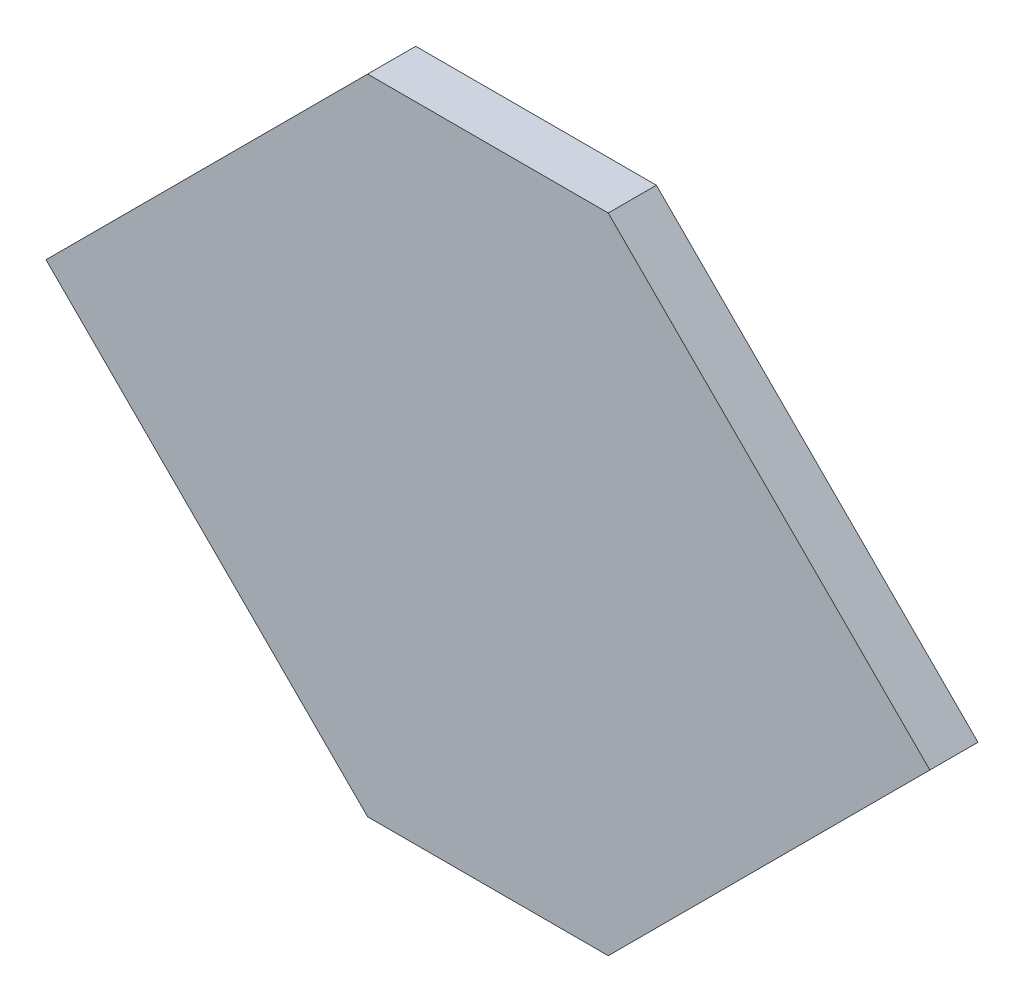
ISO-10303-21;
HEADER;
FILE_DESCRIPTION(('STEP AP214'),'2;1');
FILE_NAME('part.step','',(''),(''),'','','');
FILE_SCHEMA(('AUTOMOTIVE_DESIGN { 1 0 10303 214 1 1 1 1 }'));
ENDSEC;
DATA;
#1=APPLICATION_CONTEXT('core data for automotive mechanical design processes');
#2=APPLICATION_PROTOCOL_DEFINITION('international standard','automotive_design',2000,#1);
#3=PRODUCT_CONTEXT('',#1,'mechanical');
#4=PRODUCT('Part','Part','',(#3));
#5=PRODUCT_RELATED_PRODUCT_CATEGORY('part','',(#4));
#6=PRODUCT_DEFINITION_FORMATION('','',#4);
#7=PRODUCT_DEFINITION_CONTEXT('part definition',#1,'design');
#8=PRODUCT_DEFINITION('design','',#6,#7);
#9=PRODUCT_DEFINITION_SHAPE('','',#8);
#10=(LENGTH_UNIT() NAMED_UNIT(*) SI_UNIT(.MILLI.,.METRE.));
#11=(NAMED_UNIT(*) PLANE_ANGLE_UNIT() SI_UNIT($,.RADIAN.));
#12=(NAMED_UNIT(*) SI_UNIT($,.STERADIAN.) SOLID_ANGLE_UNIT());
#13=UNCERTAINTY_MEASURE_WITH_UNIT(LENGTH_MEASURE(1.E-05),#10,'distance_accuracy_value','');
#14=(GEOMETRIC_REPRESENTATION_CONTEXT(3) GLOBAL_UNCERTAINTY_ASSIGNED_CONTEXT((#13)) GLOBAL_UNIT_ASSIGNED_CONTEXT((#10,
#11,#12)) REPRESENTATION_CONTEXT('',''));
#15=CARTESIAN_POINT('',(0.,0.,0.));
#16=DIRECTION('',(0.,0.,1.));
#17=DIRECTION('',(1.,0.,0.));
#18=AXIS2_PLACEMENT_3D('',#15,#16,#17);
#19=CARTESIAN_POINT('',(-25.,-66.82,10.));
#20=DIRECTION('',(0.,1.,0.));
#21=DIRECTION('',(0.,0.,1.));
#22=AXIS2_PLACEMENT_3D('',#19,#20,#21);
#23=PLANE('',#22);
#24=DIRECTION('',(1.,0.,0.));
#25=VECTOR('',#24,1.);
#26=CARTESIAN_POINT('',(-25.,-66.82,0.));
#27=LINE('',#26,#25);
#28=CARTESIAN_POINT('',(-25.,-66.82,0.));
#29=VERTEX_POINT('',#28);
#30=CARTESIAN_POINT('',(25.,-66.82,0.));
#31=VERTEX_POINT('',#30);
#32=EDGE_CURVE('E118',#29,#31,#27,.T.);
#33=ORIENTED_EDGE('',*,*,#32,.T.);
#34=DIRECTION('',(0.,0.,-1.));
#35=VECTOR('',#34,1.);
#36=CARTESIAN_POINT('',(25.,-66.82,10.));
#37=LINE('',#36,#35);
#38=CARTESIAN_POINT('',(25.,-66.82,10.));
#39=VERTEX_POINT('',#38);
#40=EDGE_CURVE('E11',#39,#31,#37,.T.);
#41=ORIENTED_EDGE('',*,*,#40,.F.);
#42=DIRECTION('',(1.,0.,0.));
#43=VECTOR('',#42,1.);
#44=CARTESIAN_POINT('',(-25.,-66.82,10.));
#45=LINE('',#44,#43);
#46=CARTESIAN_POINT('',(-25.,-66.82,10.));
#47=VERTEX_POINT('',#46);
#48=EDGE_CURVE('E132',#47,#39,#45,.T.);
#49=ORIENTED_EDGE('',*,*,#48,.F.);
#50=DIRECTION('',(0.,0.,-1.));
#51=VECTOR('',#50,1.);
#52=CARTESIAN_POINT('',(-25.,-66.82,10.));
#53=LINE('',#52,#51);
#54=EDGE_CURVE('E49',#47,#29,#53,.T.);
#55=ORIENTED_EDGE('',*,*,#54,.T.);
#56=EDGE_LOOP('',(#33,#41,#49,#55));
#57=FACE_BOUND('',#56,.T.);
#58=ADVANCED_FACE('F33',(#57),#23,.F.);
#59=CARTESIAN_POINT('',(25.,-66.82,10.));
#60=DIRECTION('',(-0.707106781186546,0.707106781186549,0.));
#61=DIRECTION('',(-0.707106781186549,-0.707106781186546,0.));
#62=AXIS2_PLACEMENT_3D('',#59,#60,#61);
#63=PLANE('',#62);
#64=DIRECTION('',(0.707106781186549,0.707106781186546,0.));
#65=VECTOR('',#64,1.);
#66=CARTESIAN_POINT('',(25.,-66.82,0.));
#67=LINE('',#66,#65);
#68=CARTESIAN_POINT('',(91.8200000000003,0.,0.));
#69=VERTEX_POINT('',#68);
#70=EDGE_CURVE('E120',#31,#69,#67,.T.);
#71=ORIENTED_EDGE('',*,*,#70,.T.);
#72=DIRECTION('',(0.,0.,-1.));
#73=VECTOR('',#72,1.);
#74=CARTESIAN_POINT('',(91.8200000000003,0.,10.));
#75=LINE('',#74,#73);
#76=CARTESIAN_POINT('',(91.8200000000003,0.,10.));
#77=VERTEX_POINT('',#76);
#78=EDGE_CURVE('E41',#77,#69,#75,.T.);
#79=ORIENTED_EDGE('',*,*,#78,.F.);
#80=DIRECTION('',(0.707106781186549,0.707106781186546,0.));
#81=VECTOR('',#80,1.);
#82=CARTESIAN_POINT('',(25.,-66.82,10.));
#83=LINE('',#82,#81);
#84=EDGE_CURVE('E82',#39,#77,#83,.T.);
#85=ORIENTED_EDGE('',*,*,#84,.F.);
#86=ORIENTED_EDGE('',*,*,#40,.T.);
#87=EDGE_LOOP('',(#71,#79,#85,#86));
#88=FACE_BOUND('',#87,.T.);
#89=ADVANCED_FACE('F138',(#88),#63,.F.);
#90=CARTESIAN_POINT('',(25.,66.82,10.));
#91=DIRECTION('',(0.707106781186546,0.707106781186549,0.));
#92=DIRECTION('',(-0.707106781186549,0.707106781186546,0.));
#93=AXIS2_PLACEMENT_3D('',#90,#91,#92);
#94=PLANE('',#93);
#95=DIRECTION('',(0.707106781186549,-0.707106781186546,0.));
#96=VECTOR('',#95,1.);
#97=CARTESIAN_POINT('',(25.,66.82,0.));
#98=LINE('',#97,#96);
#99=CARTESIAN_POINT('',(25.,66.82,0.));
#100=VERTEX_POINT('',#99);
#101=EDGE_CURVE('E123',#100,#69,#98,.T.);
#102=ORIENTED_EDGE('',*,*,#101,.F.);
#103=DIRECTION('',(0.,0.,-1.));
#104=VECTOR('',#103,1.);
#105=CARTESIAN_POINT('',(25.,66.82,10.));
#106=LINE('',#105,#104);
#107=CARTESIAN_POINT('',(25.,66.82,10.));
#108=VERTEX_POINT('',#107);
#109=EDGE_CURVE('E101',#108,#100,#106,.T.);
#110=ORIENTED_EDGE('',*,*,#109,.F.);
#111=DIRECTION('',(0.707106781186549,-0.707106781186546,0.));
#112=VECTOR('',#111,1.);
#113=CARTESIAN_POINT('',(25.,66.82,10.));
#114=LINE('',#113,#112);
#115=EDGE_CURVE('E112',#108,#77,#114,.T.);
#116=ORIENTED_EDGE('',*,*,#115,.T.);
#117=ORIENTED_EDGE('',*,*,#78,.T.);
#118=EDGE_LOOP('',(#102,#110,#116,#117));
#119=FACE_BOUND('',#118,.T.);
#120=ADVANCED_FACE('F137',(#119),#94,.T.);
#121=CARTESIAN_POINT('',(-25.,66.82,10.));
#122=DIRECTION('',(0.,1.,0.));
#123=DIRECTION('',(0.,0.,1.));
#124=AXIS2_PLACEMENT_3D('',#121,#122,#123);
#125=PLANE('',#124);
#126=DIRECTION('',(1.,0.,0.));
#127=VECTOR('',#126,1.);
#128=CARTESIAN_POINT('',(-25.,66.82,0.));
#129=LINE('',#128,#127);
#130=CARTESIAN_POINT('',(-25.,66.82,0.));
#131=VERTEX_POINT('',#130);
#132=EDGE_CURVE('E98',#131,#100,#129,.T.);
#133=ORIENTED_EDGE('',*,*,#132,.F.);
#134=DIRECTION('',(0.,0.,-1.));
#135=VECTOR('',#134,1.);
#136=CARTESIAN_POINT('',(-25.,66.82,10.));
#137=LINE('',#136,#135);
#138=CARTESIAN_POINT('',(-25.,66.82,10.));
#139=VERTEX_POINT('',#138);
#140=EDGE_CURVE('E92',#139,#131,#137,.T.);
#141=ORIENTED_EDGE('',*,*,#140,.F.);
#142=DIRECTION('',(1.,0.,0.));
#143=VECTOR('',#142,1.);
#144=CARTESIAN_POINT('',(-25.,66.82,10.));
#145=LINE('',#144,#143);
#146=EDGE_CURVE('E96',#139,#108,#145,.T.);
#147=ORIENTED_EDGE('',*,*,#146,.T.);
#148=ORIENTED_EDGE('',*,*,#109,.T.);
#149=EDGE_LOOP('',(#133,#141,#147,#148));
#150=FACE_BOUND('',#149,.T.);
#151=ADVANCED_FACE('F94',(#150),#125,.T.);
#152=CARTESIAN_POINT('',(-25.,66.82,10.));
#153=DIRECTION('',(0.707106781186546,-0.707106781186549,0.));
#154=DIRECTION('',(0.707106781186549,0.707106781186546,0.));
#155=AXIS2_PLACEMENT_3D('',#152,#153,#154);
#156=PLANE('',#155);
#157=DIRECTION('',(-0.707106781186549,-0.707106781186546,0.));
#158=VECTOR('',#157,1.);
#159=CARTESIAN_POINT('',(-25.,66.82,0.));
#160=LINE('',#159,#158);
#161=CARTESIAN_POINT('',(-91.8200000000003,0.,0.));
#162=VERTEX_POINT('',#161);
#163=EDGE_CURVE('E127',#131,#162,#160,.T.);
#164=ORIENTED_EDGE('',*,*,#163,.T.);
#165=DIRECTION('',(0.,0.,-1.));
#166=VECTOR('',#165,1.);
#167=CARTESIAN_POINT('',(-91.8200000000003,0.,10.));
#168=LINE('',#167,#166);
#169=CARTESIAN_POINT('',(-91.8200000000003,0.,10.));
#170=VERTEX_POINT('',#169);
#171=EDGE_CURVE('E70',#170,#162,#168,.T.);
#172=ORIENTED_EDGE('',*,*,#171,.F.);
#173=DIRECTION('',(-0.707106781186549,-0.707106781186546,0.));
#174=VECTOR('',#173,1.);
#175=CARTESIAN_POINT('',(-25.,66.82,10.));
#176=LINE('',#175,#174);
#177=EDGE_CURVE('E103',#139,#170,#176,.T.);
#178=ORIENTED_EDGE('',*,*,#177,.F.);
#179=ORIENTED_EDGE('',*,*,#140,.T.);
#180=EDGE_LOOP('',(#164,#172,#178,#179));
#181=FACE_BOUND('',#180,.T.);
#182=ADVANCED_FACE('F104',(#181),#156,.F.);
#183=CARTESIAN_POINT('',(-25.,-66.82,10.));
#184=DIRECTION('',(-0.707106781186546,-0.707106781186549,0.));
#185=DIRECTION('',(0.707106781186549,-0.707106781186546,0.));
#186=AXIS2_PLACEMENT_3D('',#183,#184,#185);
#187=PLANE('',#186);
#188=DIRECTION('',(-0.707106781186549,0.707106781186546,0.));
#189=VECTOR('',#188,1.);
#190=CARTESIAN_POINT('',(-25.,-66.82,0.));
#191=LINE('',#190,#189);
#192=EDGE_CURVE('E129',#29,#162,#191,.T.);
#193=ORIENTED_EDGE('',*,*,#192,.F.);
#194=ORIENTED_EDGE('',*,*,#54,.F.);
#195=DIRECTION('',(-0.707106781186549,0.707106781186546,0.));
#196=VECTOR('',#195,1.);
#197=CARTESIAN_POINT('',(-25.,-66.82,10.));
#198=LINE('',#197,#196);
#199=EDGE_CURVE('E107',#47,#170,#198,.T.);
#200=ORIENTED_EDGE('',*,*,#199,.T.);
#201=ORIENTED_EDGE('',*,*,#171,.T.);
#202=EDGE_LOOP('',(#193,#194,#200,#201));
#203=FACE_BOUND('',#202,.T.);
#204=ADVANCED_FACE('F142',(#203),#187,.T.);
#205=CARTESIAN_POINT('',(0.,0.,10.));
#206=DIRECTION('',(0.,0.,1.));
#207=DIRECTION('',(1.,0.,0.));
#208=AXIS2_PLACEMENT_3D('',#205,#206,#207);
#209=PLANE('',#208);
#210=ORIENTED_EDGE('',*,*,#48,.T.);
#211=ORIENTED_EDGE('',*,*,#84,.T.);
#212=ORIENTED_EDGE('',*,*,#115,.F.);
#213=ORIENTED_EDGE('',*,*,#146,.F.);
#214=ORIENTED_EDGE('',*,*,#177,.T.);
#215=ORIENTED_EDGE('',*,*,#199,.F.);
#216=EDGE_LOOP('',(#210,#211,#212,#213,#214,#215));
#217=FACE_BOUND('',#216,.T.);
#218=ADVANCED_FACE('F110',(#217),#209,.T.);
#219=CARTESIAN_POINT('',(0.,0.,0.));
#220=DIRECTION('',(0.,0.,1.));
#221=DIRECTION('',(1.,0.,0.));
#222=AXIS2_PLACEMENT_3D('',#219,#220,#221);
#223=PLANE('',#222);
#224=ORIENTED_EDGE('',*,*,#32,.F.);
#225=ORIENTED_EDGE('',*,*,#192,.T.);
#226=ORIENTED_EDGE('',*,*,#163,.F.);
#227=ORIENTED_EDGE('',*,*,#132,.T.);
#228=ORIENTED_EDGE('',*,*,#101,.T.);
#229=ORIENTED_EDGE('',*,*,#70,.F.);
#230=EDGE_LOOP('',(#224,#225,#226,#227,#228,#229));
#231=FACE_BOUND('',#230,.T.);
#232=ADVANCED_FACE('F141',(#231),#223,.F.);
#233=CLOSED_SHELL('',(#58,#89,#120,#151,#182,#204,#218,#232));
#234=MANIFOLD_SOLID_BREP('B2',#233);
#235=ADVANCED_BREP_SHAPE_REPRESENTATION('',(#18,#234),#14);
#236=SHAPE_DEFINITION_REPRESENTATION(#9,#235);
ENDSEC;
END-ISO-10303-21;
